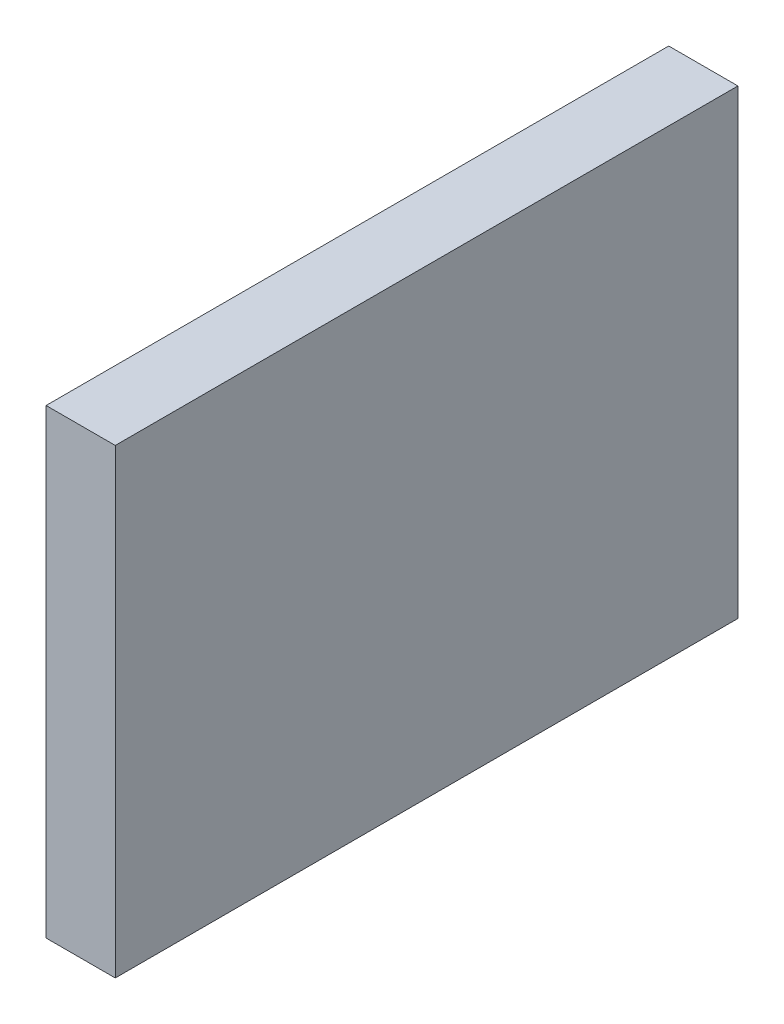
ISO-10303-21;
HEADER;
FILE_DESCRIPTION(('STEP AP214'),'2;1');
FILE_NAME('part.step','',(''),(''),'','','');
FILE_SCHEMA(('AUTOMOTIVE_DESIGN { 1 0 10303 214 1 1 1 1 }'));
ENDSEC;
DATA;
#1=APPLICATION_CONTEXT('core data for automotive mechanical design processes');
#2=APPLICATION_PROTOCOL_DEFINITION('international standard','automotive_design',2000,#1);
#3=PRODUCT_CONTEXT('',#1,'mechanical');
#4=PRODUCT('Part','Part','',(#3));
#5=PRODUCT_RELATED_PRODUCT_CATEGORY('part','',(#4));
#6=PRODUCT_DEFINITION_FORMATION('','',#4);
#7=PRODUCT_DEFINITION_CONTEXT('part definition',#1,'design');
#8=PRODUCT_DEFINITION('design','',#6,#7);
#9=PRODUCT_DEFINITION_SHAPE('','',#8);
#10=(LENGTH_UNIT() NAMED_UNIT(*) SI_UNIT(.MILLI.,.METRE.));
#11=(NAMED_UNIT(*) PLANE_ANGLE_UNIT() SI_UNIT($,.RADIAN.));
#12=(NAMED_UNIT(*) SI_UNIT($,.STERADIAN.) SOLID_ANGLE_UNIT());
#13=UNCERTAINTY_MEASURE_WITH_UNIT(LENGTH_MEASURE(1.E-05),#10,'distance_accuracy_value','');
#14=(GEOMETRIC_REPRESENTATION_CONTEXT(3) GLOBAL_UNCERTAINTY_ASSIGNED_CONTEXT((#13)) GLOBAL_UNIT_ASSIGNED_CONTEXT((#10,
#11,#12)) REPRESENTATION_CONTEXT('',''));
#15=CARTESIAN_POINT('',(0.,0.,0.));
#16=DIRECTION('',(0.,0.,1.));
#17=DIRECTION('',(1.,0.,0.));
#18=AXIS2_PLACEMENT_3D('',#15,#16,#17);
#19=CARTESIAN_POINT('',(-10.7050884955752,15.4675884955752,171.45));
#20=DIRECTION('',(1.,0.,0.));
#21=DIRECTION('',(0.,1.,0.));
#22=AXIS2_PLACEMENT_3D('',#19,#20,#21);
#23=PLANE('',#22);
#24=DIRECTION('',(0.,-1.,0.));
#25=VECTOR('',#24,1.);
#26=CARTESIAN_POINT('',(-10.7050884955752,15.4675884955752,0.));
#27=LINE('',#26,#25);
#28=CARTESIAN_POINT('',(-10.7050884955752,15.4675884955752,0.));
#29=VERTEX_POINT('',#28);
#30=CARTESIAN_POINT('',(-10.7050884955752,-111.532411504425,0.));
#31=VERTEX_POINT('',#30);
#32=EDGE_CURVE('E96',#29,#31,#27,.T.);
#33=ORIENTED_EDGE('',*,*,#32,.T.);
#34=DIRECTION('',(0.,0.,-1.));
#35=VECTOR('',#34,1.);
#36=CARTESIAN_POINT('',(-10.7050884955752,-111.532411504425,171.45));
#37=LINE('',#36,#35);
#38=CARTESIAN_POINT('',(-10.7050884955752,-111.532411504425,171.45));
#39=VERTEX_POINT('',#38);
#40=EDGE_CURVE('E11',#39,#31,#37,.T.);
#41=ORIENTED_EDGE('',*,*,#40,.F.);
#42=DIRECTION('',(0.,-1.,0.));
#43=VECTOR('',#42,1.);
#44=CARTESIAN_POINT('',(-10.7050884955752,15.4675884955752,171.45));
#45=LINE('',#44,#43);
#46=CARTESIAN_POINT('',(-10.7050884955752,15.4675884955752,171.45));
#47=VERTEX_POINT('',#46);
#48=EDGE_CURVE('E84',#47,#39,#45,.T.);
#49=ORIENTED_EDGE('',*,*,#48,.F.);
#50=DIRECTION('',(0.,0.,-1.));
#51=VECTOR('',#50,1.);
#52=CARTESIAN_POINT('',(-10.7050884955752,15.4675884955752,171.45));
#53=LINE('',#52,#51);
#54=EDGE_CURVE('E92',#47,#29,#53,.T.);
#55=ORIENTED_EDGE('',*,*,#54,.T.);
#56=EDGE_LOOP('',(#33,#41,#49,#55));
#57=FACE_BOUND('',#56,.T.);
#58=ADVANCED_FACE('F33',(#57),#23,.F.);
#59=CARTESIAN_POINT('',(-10.7050884955752,-111.532411504425,171.45));
#60=DIRECTION('',(0.,1.,0.));
#61=DIRECTION('',(0.,0.,1.));
#62=AXIS2_PLACEMENT_3D('',#59,#60,#61);
#63=PLANE('',#62);
#64=DIRECTION('',(1.,0.,0.));
#65=VECTOR('',#64,1.);
#66=CARTESIAN_POINT('',(-10.7050884955752,-111.532411504425,0.));
#67=LINE('',#66,#65);
#68=CARTESIAN_POINT('',(8.3449115044248,-111.532411504425,0.));
#69=VERTEX_POINT('',#68);
#70=EDGE_CURVE('E88',#31,#69,#67,.T.);
#71=ORIENTED_EDGE('',*,*,#70,.T.);
#72=DIRECTION('',(0.,0.,-1.));
#73=VECTOR('',#72,1.);
#74=CARTESIAN_POINT('',(8.3449115044248,-111.532411504425,171.45));
#75=LINE('',#74,#73);
#76=CARTESIAN_POINT('',(8.3449115044248,-111.532411504425,171.45));
#77=VERTEX_POINT('',#76);
#78=EDGE_CURVE('E41',#77,#69,#75,.T.);
#79=ORIENTED_EDGE('',*,*,#78,.F.);
#80=DIRECTION('',(1.,0.,0.));
#81=VECTOR('',#80,1.);
#82=CARTESIAN_POINT('',(-10.7050884955752,-111.532411504425,171.45));
#83=LINE('',#82,#81);
#84=EDGE_CURVE('E79',#39,#77,#83,.T.);
#85=ORIENTED_EDGE('',*,*,#84,.F.);
#86=ORIENTED_EDGE('',*,*,#40,.T.);
#87=EDGE_LOOP('',(#71,#79,#85,#86));
#88=FACE_BOUND('',#87,.T.);
#89=ADVANCED_FACE('F87',(#88),#63,.F.);
#90=CARTESIAN_POINT('',(8.34491150442478,15.4675884955752,171.45));
#91=DIRECTION('',(-1.,0.,0.));
#92=DIRECTION('',(0.,-1.,0.));
#93=AXIS2_PLACEMENT_3D('',#90,#91,#92);
#94=PLANE('',#93);
#95=DIRECTION('',(0.,1.,0.));
#96=VECTOR('',#95,1.);
#97=CARTESIAN_POINT('',(8.34491150442478,15.4675884955752,0.));
#98=LINE('',#97,#96);
#99=CARTESIAN_POINT('',(8.34491150442478,15.4675884955752,0.));
#100=VERTEX_POINT('',#99);
#101=EDGE_CURVE('E66',#69,#100,#98,.T.);
#102=ORIENTED_EDGE('',*,*,#101,.T.);
#103=DIRECTION('',(0.,0.,-1.));
#104=VECTOR('',#103,1.);
#105=CARTESIAN_POINT('',(8.34491150442478,15.4675884955752,171.45));
#106=LINE('',#105,#104);
#107=CARTESIAN_POINT('',(8.34491150442478,15.4675884955752,171.45));
#108=VERTEX_POINT('',#107);
#109=EDGE_CURVE('E89',#108,#100,#106,.T.);
#110=ORIENTED_EDGE('',*,*,#109,.F.);
#111=DIRECTION('',(0.,1.,0.));
#112=VECTOR('',#111,1.);
#113=CARTESIAN_POINT('',(8.34491150442478,15.4675884955752,171.45));
#114=LINE('',#113,#112);
#115=EDGE_CURVE('E82',#77,#108,#114,.T.);
#116=ORIENTED_EDGE('',*,*,#115,.F.);
#117=ORIENTED_EDGE('',*,*,#78,.T.);
#118=EDGE_LOOP('',(#102,#110,#116,#117));
#119=FACE_BOUND('',#118,.T.);
#120=ADVANCED_FACE('F90',(#119),#94,.F.);
#121=CARTESIAN_POINT('',(-10.7050884955752,15.4675884955752,171.45));
#122=DIRECTION('',(0.,-1.,0.));
#123=DIRECTION('',(0.,0.,-1.));
#124=AXIS2_PLACEMENT_3D('',#121,#122,#123);
#125=PLANE('',#124);
#126=DIRECTION('',(-1.,0.,0.));
#127=VECTOR('',#126,1.);
#128=CARTESIAN_POINT('',(-10.7050884955752,15.4675884955752,0.));
#129=LINE('',#128,#127);
#130=EDGE_CURVE('E72',#100,#29,#129,.T.);
#131=ORIENTED_EDGE('',*,*,#130,.T.);
#132=ORIENTED_EDGE('',*,*,#54,.F.);
#133=DIRECTION('',(-1.,0.,0.));
#134=VECTOR('',#133,1.);
#135=CARTESIAN_POINT('',(-10.7050884955752,15.4675884955752,171.45));
#136=LINE('',#135,#134);
#137=EDGE_CURVE('E49',#108,#47,#136,.T.);
#138=ORIENTED_EDGE('',*,*,#137,.F.);
#139=ORIENTED_EDGE('',*,*,#109,.T.);
#140=EDGE_LOOP('',(#131,#132,#138,#139));
#141=FACE_BOUND('',#140,.T.);
#142=ADVANCED_FACE('F103',(#141),#125,.F.);
#143=CARTESIAN_POINT('',(0.,0.,171.45));
#144=DIRECTION('',(0.,0.,1.));
#145=DIRECTION('',(1.,0.,0.));
#146=AXIS2_PLACEMENT_3D('',#143,#144,#145);
#147=PLANE('',#146);
#148=ORIENTED_EDGE('',*,*,#48,.T.);
#149=ORIENTED_EDGE('',*,*,#84,.T.);
#150=ORIENTED_EDGE('',*,*,#115,.T.);
#151=ORIENTED_EDGE('',*,*,#137,.T.);
#152=EDGE_LOOP('',(#148,#149,#150,#151));
#153=FACE_BOUND('',#152,.T.);
#154=ADVANCED_FACE('F80',(#153),#147,.T.);
#155=CARTESIAN_POINT('',(0.,0.,0.));
#156=DIRECTION('',(0.,0.,1.));
#157=DIRECTION('',(1.,0.,0.));
#158=AXIS2_PLACEMENT_3D('',#155,#156,#157);
#159=PLANE('',#158);
#160=ORIENTED_EDGE('',*,*,#32,.F.);
#161=ORIENTED_EDGE('',*,*,#130,.F.);
#162=ORIENTED_EDGE('',*,*,#101,.F.);
#163=ORIENTED_EDGE('',*,*,#70,.F.);
#164=EDGE_LOOP('',(#160,#161,#162,#163));
#165=FACE_BOUND('',#164,.T.);
#166=ADVANCED_FACE('F106',(#165),#159,.F.);
#167=CLOSED_SHELL('',(#58,#89,#120,#142,#154,#166));
#168=MANIFOLD_SOLID_BREP('B2',#167);
#169=ADVANCED_BREP_SHAPE_REPRESENTATION('',(#18,#168),#14);
#170=SHAPE_DEFINITION_REPRESENTATION(#9,#169);
ENDSEC;
END-ISO-10303-21;
